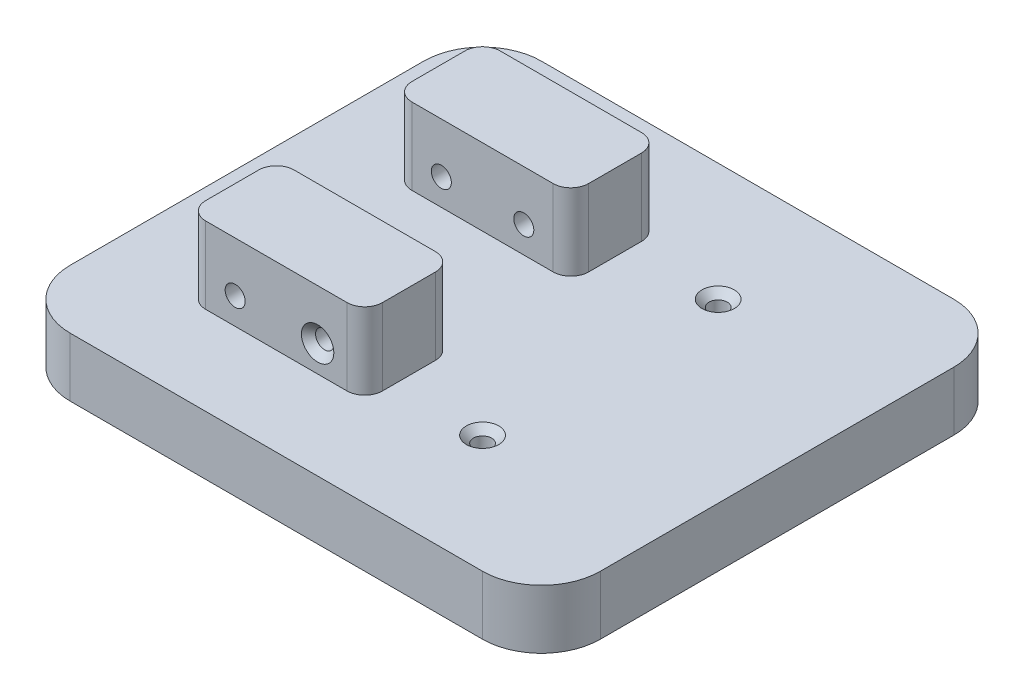
ISO-10303-21;
HEADER;
FILE_DESCRIPTION(('STEP AP214'),'2;1');
FILE_NAME('part.step','',(''),(''),'','','');
FILE_SCHEMA(('AUTOMOTIVE_DESIGN { 1 0 10303 214 1 1 1 1 }'));
ENDSEC;
DATA;
#1=APPLICATION_CONTEXT('core data for automotive mechanical design processes');
#2=APPLICATION_PROTOCOL_DEFINITION('international standard','automotive_design',2000,#1);
#3=PRODUCT_CONTEXT('',#1,'mechanical');
#4=PRODUCT('Part','Part','',(#3));
#5=PRODUCT_RELATED_PRODUCT_CATEGORY('part','',(#4));
#6=PRODUCT_DEFINITION_FORMATION('','',#4);
#7=PRODUCT_DEFINITION_CONTEXT('part definition',#1,'design');
#8=PRODUCT_DEFINITION('design','',#6,#7);
#9=PRODUCT_DEFINITION_SHAPE('','',#8);
#10=(LENGTH_UNIT() NAMED_UNIT(*) SI_UNIT(.MILLI.,.METRE.));
#11=(NAMED_UNIT(*) PLANE_ANGLE_UNIT() SI_UNIT($,.RADIAN.));
#12=(NAMED_UNIT(*) SI_UNIT($,.STERADIAN.) SOLID_ANGLE_UNIT());
#13=UNCERTAINTY_MEASURE_WITH_UNIT(LENGTH_MEASURE(1.E-05),#10,'distance_accuracy_value','');
#14=(GEOMETRIC_REPRESENTATION_CONTEXT(3) GLOBAL_UNCERTAINTY_ASSIGNED_CONTEXT((#13)) GLOBAL_UNIT_ASSIGNED_CONTEXT((#10,
#11,#12)) REPRESENTATION_CONTEXT('',''));
#15=CARTESIAN_POINT('',(0.,0.,0.));
#16=DIRECTION('',(0.,0.,1.));
#17=DIRECTION('',(1.,0.,0.));
#18=AXIS2_PLACEMENT_3D('',#15,#16,#17);
#19=CARTESIAN_POINT('',(-2.6,23.,29.4));
#20=DIRECTION('',(0.,0.,-1.));
#21=DIRECTION('',(-1.,0.,0.));
#22=AXIS2_PLACEMENT_3D('',#19,#20,#21);
#23=PLANE('',#22);
#24=CARTESIAN_POINT('',(-24.6,14.5,29.4));
#25=DIRECTION('',(0.,0.,1.));
#26=DIRECTION('',(1.,0.,0.));
#27=AXIS2_PLACEMENT_3D('',#24,#25,#26);
#28=CIRCLE('',#27,1.7);
#29=CARTESIAN_POINT('',(-22.9,14.5,29.4));
#30=VERTEX_POINT('',#29);
#31=EDGE_CURVE('E767',#30,#30,#28,.T.);
#32=ORIENTED_EDGE('',*,*,#31,.F.);
#33=EDGE_LOOP('',(#32));
#34=FACE_BOUND('',#33,.T.);
#35=DIRECTION('',(1.,0.,0.));
#36=VECTOR('',#35,1.);
#37=CARTESIAN_POINT('',(-2.6,10.,29.4));
#38=LINE('',#37,#36);
#39=CARTESIAN_POINT('',(-29.6,10.,29.4));
#40=VERTEX_POINT('',#39);
#41=CARTESIAN_POINT('',(-5.6,10.,29.4));
#42=VERTEX_POINT('',#41);
#43=EDGE_CURVE('E367',#40,#42,#38,.T.);
#44=ORIENTED_EDGE('',*,*,#43,.T.);
#45=DIRECTION('',(0.,-1.,0.));
#46=VECTOR('',#45,1.);
#47=CARTESIAN_POINT('',(-5.6,23.,29.4));
#48=LINE('',#47,#46);
#49=CARTESIAN_POINT('',(-5.6,23.,29.4));
#50=VERTEX_POINT('',#49);
#51=EDGE_CURVE('E300',#42,#50,#48,.F.);
#52=ORIENTED_EDGE('',*,*,#51,.T.);
#53=DIRECTION('',(1.,0.,0.));
#54=VECTOR('',#53,1.);
#55=CARTESIAN_POINT('',(-2.6,23.,29.4));
#56=LINE('',#55,#54);
#57=CARTESIAN_POINT('',(-29.6,23.,29.4));
#58=VERTEX_POINT('',#57);
#59=EDGE_CURVE('E355',#58,#50,#56,.T.);
#60=ORIENTED_EDGE('',*,*,#59,.F.);
#61=DIRECTION('',(0.,-1.,0.));
#62=VECTOR('',#61,1.);
#63=CARTESIAN_POINT('',(-29.6,23.,29.4));
#64=LINE('',#63,#62);
#65=EDGE_CURVE('E297',#58,#40,#64,.T.);
#66=ORIENTED_EDGE('',*,*,#65,.T.);
#67=EDGE_LOOP('',(#44,#52,#60,#66));
#68=FACE_BOUND('',#67,.T.);
#69=CARTESIAN_POINT('',(-10.6,14.5,29.4));
#70=DIRECTION('',(0.,0.,1.));
#71=DIRECTION('',(1.,0.,0.));
#72=AXIS2_PLACEMENT_3D('',#69,#70,#71);
#73=CIRCLE('',#72,2.75);
#74=CARTESIAN_POINT('',(-7.85000000000002,14.5,29.4));
#75=VERTEX_POINT('',#74);
#76=EDGE_CURVE('E775',#75,#75,#73,.T.);
#77=ORIENTED_EDGE('',*,*,#76,.F.);
#78=EDGE_LOOP('',(#77));
#79=FACE_BOUND('',#78,.T.);
#80=ADVANCED_FACE('F38',(#34,#68,#79),#23,.F.);
#81=CARTESIAN_POINT('',(0.,10.,0.));
#82=DIRECTION('',(0.,-1.,0.));
#83=DIRECTION('',(0.,0.,-1.));
#84=AXIS2_PLACEMENT_3D('',#81,#82,#83);
#85=PLANE('',#84);
#86=DIRECTION('',(-1.,0.,0.));
#87=VECTOR('',#86,1.);
#88=CARTESIAN_POINT('',(-2.6,10.,-20.6));
#89=LINE('',#88,#87);
#90=CARTESIAN_POINT('',(-5.6,10.,-20.6));
#91=VERTEX_POINT('',#90);
#92=CARTESIAN_POINT('',(-29.6,10.,-20.6));
#93=VERTEX_POINT('',#92);
#94=EDGE_CURVE('E364',#91,#93,#89,.T.);
#95=ORIENTED_EDGE('',*,*,#94,.F.);
#96=CARTESIAN_POINT('',(-5.6,10.,-17.6));
#97=DIRECTION('',(0.,-1.,0.));
#98=DIRECTION('',(0.,0.,-1.));
#99=AXIS2_PLACEMENT_3D('',#96,#97,#98);
#100=CIRCLE('',#99,3.);
#101=CARTESIAN_POINT('',(-2.6,10.,-17.6));
#102=VERTEX_POINT('',#101);
#103=EDGE_CURVE('E319',#91,#102,#100,.T.);
#104=ORIENTED_EDGE('',*,*,#103,.T.);
#105=DIRECTION('',(0.,0.,-1.));
#106=VECTOR('',#105,1.);
#107=CARTESIAN_POINT('',(-2.6,10.,-5.59999999999999));
#108=LINE('',#107,#106);
#109=CARTESIAN_POINT('',(-2.6,10.,-8.59999999999999));
#110=VERTEX_POINT('',#109);
#111=EDGE_CURVE('E376',#110,#102,#108,.T.);
#112=ORIENTED_EDGE('',*,*,#111,.F.);
#113=CARTESIAN_POINT('',(-5.6,10.,-8.59999999999999));
#114=DIRECTION('',(0.,-1.,0.));
#115=DIRECTION('',(0.,0.,-1.));
#116=AXIS2_PLACEMENT_3D('',#113,#114,#115);
#117=CIRCLE('',#116,3.);
#118=CARTESIAN_POINT('',(-5.6,10.,-5.59999999999999));
#119=VERTEX_POINT('',#118);
#120=EDGE_CURVE('E321',#110,#119,#117,.T.);
#121=ORIENTED_EDGE('',*,*,#120,.T.);
#122=DIRECTION('',(1.,0.,0.));
#123=VECTOR('',#122,1.);
#124=CARTESIAN_POINT('',(-32.6,10.,-5.59999999999999));
#125=LINE('',#124,#123);
#126=CARTESIAN_POINT('',(-29.6,10.,-5.59999999999999));
#127=VERTEX_POINT('',#126);
#128=EDGE_CURVE('E391',#127,#119,#125,.T.);
#129=ORIENTED_EDGE('',*,*,#128,.F.);
#130=CARTESIAN_POINT('',(-29.6,10.,-8.59999999999999));
#131=DIRECTION('',(0.,-1.,0.));
#132=DIRECTION('',(0.,0.,-1.));
#133=AXIS2_PLACEMENT_3D('',#130,#131,#132);
#134=CIRCLE('',#133,3.);
#135=CARTESIAN_POINT('',(-32.6,10.,-8.59999999999999));
#136=VERTEX_POINT('',#135);
#137=EDGE_CURVE('E325',#127,#136,#134,.T.);
#138=ORIENTED_EDGE('',*,*,#137,.T.);
#139=DIRECTION('',(0.,0.,1.));
#140=VECTOR('',#139,1.);
#141=CARTESIAN_POINT('',(-32.6,10.,-20.6));
#142=LINE('',#141,#140);
#143=CARTESIAN_POINT('',(-32.6,10.,-17.6));
#144=VERTEX_POINT('',#143);
#145=EDGE_CURVE('E388',#144,#136,#142,.T.);
#146=ORIENTED_EDGE('',*,*,#145,.F.);
#147=CARTESIAN_POINT('',(-29.6,10.,-17.6));
#148=DIRECTION('',(0.,-1.,0.));
#149=DIRECTION('',(0.,0.,-1.));
#150=AXIS2_PLACEMENT_3D('',#147,#148,#149);
#151=CIRCLE('',#150,3.);
#152=EDGE_CURVE('E323',#144,#93,#151,.T.);
#153=ORIENTED_EDGE('',*,*,#152,.T.);
#154=EDGE_LOOP('',(#95,#104,#112,#121,#129,#138,#146,#153));
#155=FACE_BOUND('',#154,.T.);
#156=CARTESIAN_POINT('',(12.4,10.,-15.6));
#157=DIRECTION('',(0.,1.,0.));
#158=DIRECTION('',(0.,0.,1.));
#159=AXIS2_PLACEMENT_3D('',#156,#157,#158);
#160=CIRCLE('',#159,2.75);
#161=CARTESIAN_POINT('',(12.4,10.,-12.85));
#162=VERTEX_POINT('',#161);
#163=EDGE_CURVE('E385',#162,#162,#160,.T.);
#164=ORIENTED_EDGE('',*,*,#163,.F.);
#165=EDGE_LOOP('',(#164));
#166=FACE_BOUND('',#165,.T.);
#167=CARTESIAN_POINT('',(12.4,10.,24.4));
#168=DIRECTION('',(0.,1.,0.));
#169=DIRECTION('',(0.,0.,1.));
#170=AXIS2_PLACEMENT_3D('',#167,#168,#169);
#171=CIRCLE('',#170,2.75);
#172=CARTESIAN_POINT('',(12.4,10.,27.15));
#173=VERTEX_POINT('',#172);
#174=EDGE_CURVE('E404',#173,#173,#171,.T.);
#175=ORIENTED_EDGE('',*,*,#174,.F.);
#176=EDGE_LOOP('',(#175));
#177=FACE_BOUND('',#176,.T.);
#178=DIRECTION('',(-1.,0.,0.));
#179=VECTOR('',#178,1.);
#180=CARTESIAN_POINT('',(-47.6,10.,-35.6));
#181=LINE('',#180,#179);
#182=CARTESIAN_POINT('',(32.3999999999999,10.,-35.6));
#183=VERTEX_POINT('',#182);
#184=CARTESIAN_POINT('',(-37.6,10.,-35.6));
#185=VERTEX_POINT('',#184);
#186=EDGE_CURVE('E237',#183,#185,#181,.T.);
#187=ORIENTED_EDGE('',*,*,#186,.T.);
#188=CARTESIAN_POINT('',(-37.6,10.,-25.6));
#189=DIRECTION('',(0.,-1.,0.));
#190=DIRECTION('',(0.,0.,-1.));
#191=AXIS2_PLACEMENT_3D('',#188,#189,#190);
#192=CIRCLE('',#191,10.);
#193=CARTESIAN_POINT('',(-47.6,10.,-25.6));
#194=VERTEX_POINT('',#193);
#195=EDGE_CURVE('E252',#185,#194,#192,.F.);
#196=ORIENTED_EDGE('',*,*,#195,.T.);
#197=DIRECTION('',(0.,0.,1.));
#198=VECTOR('',#197,1.);
#199=CARTESIAN_POINT('',(-47.6,10.,-35.6));
#200=LINE('',#199,#198);
#201=CARTESIAN_POINT('',(-47.6,10.,34.4));
#202=VERTEX_POINT('',#201);
#203=EDGE_CURVE('E218',#194,#202,#200,.T.);
#204=ORIENTED_EDGE('',*,*,#203,.T.);
#205=CARTESIAN_POINT('',(-37.6,10.,34.4));
#206=DIRECTION('',(0.,-1.,0.));
#207=DIRECTION('',(0.,0.,-1.));
#208=AXIS2_PLACEMENT_3D('',#205,#206,#207);
#209=CIRCLE('',#208,10.);
#210=CARTESIAN_POINT('',(-37.6,10.,44.4));
#211=VERTEX_POINT('',#210);
#212=EDGE_CURVE('E248',#202,#211,#209,.F.);
#213=ORIENTED_EDGE('',*,*,#212,.T.);
#214=DIRECTION('',(1.,0.,0.));
#215=VECTOR('',#214,1.);
#216=CARTESIAN_POINT('',(42.4,10.,44.4));
#217=LINE('',#216,#215);
#218=CARTESIAN_POINT('',(32.4,10.,44.4));
#219=VERTEX_POINT('',#218);
#220=EDGE_CURVE('E415',#211,#219,#217,.T.);
#221=ORIENTED_EDGE('',*,*,#220,.T.);
#222=CARTESIAN_POINT('',(32.4,10.,34.4));
#223=DIRECTION('',(0.,-1.,0.));
#224=DIRECTION('',(0.,0.,-1.));
#225=AXIS2_PLACEMENT_3D('',#222,#223,#224);
#226=CIRCLE('',#225,10.);
#227=CARTESIAN_POINT('',(42.4,10.,34.4));
#228=VERTEX_POINT('',#227);
#229=EDGE_CURVE('E246',#219,#228,#226,.F.);
#230=ORIENTED_EDGE('',*,*,#229,.T.);
#231=DIRECTION('',(0.,0.,-1.));
#232=VECTOR('',#231,1.);
#233=CARTESIAN_POINT('',(42.4,10.,-35.6));
#234=LINE('',#233,#232);
#235=CARTESIAN_POINT('',(42.4,10.,-25.6));
#236=VERTEX_POINT('',#235);
#237=EDGE_CURVE('E238',#228,#236,#234,.T.);
#238=ORIENTED_EDGE('',*,*,#237,.T.);
#239=CARTESIAN_POINT('',(32.4,10.,-25.6));
#240=DIRECTION('',(0.,-1.,0.));
#241=DIRECTION('',(0.,0.,-1.));
#242=AXIS2_PLACEMENT_3D('',#239,#240,#241);
#243=CIRCLE('',#242,10.);
#244=EDGE_CURVE('E250',#236,#183,#243,.F.);
#245=ORIENTED_EDGE('',*,*,#244,.T.);
#246=EDGE_LOOP('',(#187,#196,#204,#213,#221,#230,#238,#245));
#247=FACE_BOUND('',#246,.T.);
#248=DIRECTION('',(-1.,0.,0.));
#249=VECTOR('',#248,1.);
#250=CARTESIAN_POINT('',(-32.6,10.,14.4));
#251=LINE('',#250,#249);
#252=CARTESIAN_POINT('',(-5.6,10.,14.4));
#253=VERTEX_POINT('',#252);
#254=CARTESIAN_POINT('',(-29.6,10.,14.4));
#255=VERTEX_POINT('',#254);
#256=EDGE_CURVE('E333',#253,#255,#251,.T.);
#257=ORIENTED_EDGE('',*,*,#256,.F.);
#258=CARTESIAN_POINT('',(-5.6,10.,17.4));
#259=DIRECTION('',(0.,-1.,0.));
#260=DIRECTION('',(0.,0.,-1.));
#261=AXIS2_PLACEMENT_3D('',#258,#259,#260);
#262=CIRCLE('',#261,3.);
#263=CARTESIAN_POINT('',(-2.6,10.,17.4));
#264=VERTEX_POINT('',#263);
#265=EDGE_CURVE('E329',#253,#264,#262,.T.);
#266=ORIENTED_EDGE('',*,*,#265,.T.);
#267=DIRECTION('',(0.,0.,-1.));
#268=VECTOR('',#267,1.);
#269=CARTESIAN_POINT('',(-2.6,10.,14.4));
#270=LINE('',#269,#268);
#271=CARTESIAN_POINT('',(-2.6,10.,26.4));
#272=VERTEX_POINT('',#271);
#273=EDGE_CURVE('E359',#272,#264,#270,.T.);
#274=ORIENTED_EDGE('',*,*,#273,.F.);
#275=CARTESIAN_POINT('',(-5.6,10.,26.4));
#276=DIRECTION('',(0.,-1.,0.));
#277=DIRECTION('',(0.,0.,-1.));
#278=AXIS2_PLACEMENT_3D('',#275,#276,#277);
#279=CIRCLE('',#278,3.);
#280=EDGE_CURVE('E327',#272,#42,#279,.T.);
#281=ORIENTED_EDGE('',*,*,#280,.T.);
#282=ORIENTED_EDGE('',*,*,#43,.F.);
#283=CARTESIAN_POINT('',(-29.6,10.,26.4));
#284=DIRECTION('',(0.,-1.,0.));
#285=DIRECTION('',(0.,0.,-1.));
#286=AXIS2_PLACEMENT_3D('',#283,#284,#285);
#287=CIRCLE('',#286,3.);
#288=CARTESIAN_POINT('',(-32.6,10.,26.4));
#289=VERTEX_POINT('',#288);
#290=EDGE_CURVE('E11',#40,#289,#287,.T.);
#291=ORIENTED_EDGE('',*,*,#290,.T.);
#292=DIRECTION('',(0.,0.,1.));
#293=VECTOR('',#292,1.);
#294=CARTESIAN_POINT('',(-32.6,10.,29.4));
#295=LINE('',#294,#293);
#296=CARTESIAN_POINT('',(-32.6,10.,17.4));
#297=VERTEX_POINT('',#296);
#298=EDGE_CURVE('E334',#297,#289,#295,.T.);
#299=ORIENTED_EDGE('',*,*,#298,.F.);
#300=CARTESIAN_POINT('',(-29.6,10.,17.4));
#301=DIRECTION('',(0.,-1.,0.));
#302=DIRECTION('',(0.,0.,-1.));
#303=AXIS2_PLACEMENT_3D('',#300,#301,#302);
#304=CIRCLE('',#303,3.);
#305=EDGE_CURVE('E46',#297,#255,#304,.T.);
#306=ORIENTED_EDGE('',*,*,#305,.T.);
#307=EDGE_LOOP('',(#257,#266,#274,#281,#282,#291,#299,#306));
#308=FACE_BOUND('',#307,.T.);
#309=ADVANCED_FACE('F332',(#155,#166,#177,#247,#308),#85,.F.);
#310=CARTESIAN_POINT('',(-47.6,10.,-35.6));
#311=DIRECTION('',(0.,0.,1.));
#312=DIRECTION('',(1.,0.,0.));
#313=AXIS2_PLACEMENT_3D('',#310,#311,#312);
#314=PLANE('',#313);
#315=DIRECTION('',(-1.,0.,0.));
#316=VECTOR('',#315,1.);
#317=CARTESIAN_POINT('',(-47.6,0.,-35.6));
#318=LINE('',#317,#316);
#319=CARTESIAN_POINT('',(32.3999999999999,0.,-35.6));
#320=VERTEX_POINT('',#319);
#321=CARTESIAN_POINT('',(-37.6,0.,-35.6));
#322=VERTEX_POINT('',#321);
#323=EDGE_CURVE('E226',#320,#322,#318,.T.);
#324=ORIENTED_EDGE('',*,*,#323,.T.);
#325=DIRECTION('',(0.,-1.,0.));
#326=VECTOR('',#325,1.);
#327=CARTESIAN_POINT('',(-37.6,10.,-35.6));
#328=LINE('',#327,#326);
#329=EDGE_CURVE('E203',#322,#185,#328,.F.);
#330=ORIENTED_EDGE('',*,*,#329,.T.);
#331=ORIENTED_EDGE('',*,*,#186,.F.);
#332=DIRECTION('',(0.,-1.,0.));
#333=VECTOR('',#332,1.);
#334=CARTESIAN_POINT('',(32.4,10.,-35.6));
#335=LINE('',#334,#333);
#336=EDGE_CURVE('E208',#183,#320,#335,.T.);
#337=ORIENTED_EDGE('',*,*,#336,.T.);
#338=EDGE_LOOP('',(#324,#330,#331,#337));
#339=FACE_BOUND('',#338,.T.);
#340=ADVANCED_FACE('F430',(#339),#314,.F.);
#341=CARTESIAN_POINT('',(-47.6,10.,-35.6));
#342=DIRECTION('',(1.,0.,0.));
#343=DIRECTION('',(0.,0.,-1.));
#344=AXIS2_PLACEMENT_3D('',#341,#342,#343);
#345=PLANE('',#344);
#346=ORIENTED_EDGE('',*,*,#203,.F.);
#347=DIRECTION('',(0.,-1.,0.));
#348=VECTOR('',#347,1.);
#349=CARTESIAN_POINT('',(-47.6,10.,-25.6));
#350=LINE('',#349,#348);
#351=CARTESIAN_POINT('',(-47.6,0.,-25.6));
#352=VERTEX_POINT('',#351);
#353=EDGE_CURVE('E202',#194,#352,#350,.T.);
#354=ORIENTED_EDGE('',*,*,#353,.T.);
#355=DIRECTION('',(0.,0.,1.));
#356=VECTOR('',#355,1.);
#357=CARTESIAN_POINT('',(-47.6,0.,-35.6));
#358=LINE('',#357,#356);
#359=CARTESIAN_POINT('',(-47.6,0.,34.4));
#360=VERTEX_POINT('',#359);
#361=EDGE_CURVE('E215',#352,#360,#358,.T.);
#362=ORIENTED_EDGE('',*,*,#361,.T.);
#363=DIRECTION('',(0.,-1.,0.));
#364=VECTOR('',#363,1.);
#365=CARTESIAN_POINT('',(-47.6,10.,34.4));
#366=LINE('',#365,#364);
#367=EDGE_CURVE('E220',#360,#202,#366,.F.);
#368=ORIENTED_EDGE('',*,*,#367,.T.);
#369=EDGE_LOOP('',(#346,#354,#362,#368));
#370=FACE_BOUND('',#369,.T.);
#371=ADVANCED_FACE('F214',(#370),#345,.F.);
#372=CARTESIAN_POINT('',(42.4,10.,44.4));
#373=DIRECTION('',(0.,0.,-1.));
#374=DIRECTION('',(-1.,0.,0.));
#375=AXIS2_PLACEMENT_3D('',#372,#373,#374);
#376=PLANE('',#375);
#377=ORIENTED_EDGE('',*,*,#220,.F.);
#378=DIRECTION('',(0.,-1.,0.));
#379=VECTOR('',#378,1.);
#380=CARTESIAN_POINT('',(-37.6,10.,44.4));
#381=LINE('',#380,#379);
#382=CARTESIAN_POINT('',(-37.6,0.,44.4));
#383=VERTEX_POINT('',#382);
#384=EDGE_CURVE('E261',#211,#383,#381,.T.);
#385=ORIENTED_EDGE('',*,*,#384,.T.);
#386=DIRECTION('',(1.,0.,0.));
#387=VECTOR('',#386,1.);
#388=CARTESIAN_POINT('',(42.4,0.,44.4));
#389=LINE('',#388,#387);
#390=CARTESIAN_POINT('',(32.4,0.,44.4));
#391=VERTEX_POINT('',#390);
#392=EDGE_CURVE('E225',#383,#391,#389,.T.);
#393=ORIENTED_EDGE('',*,*,#392,.T.);
#394=DIRECTION('',(0.,-1.,0.));
#395=VECTOR('',#394,1.);
#396=CARTESIAN_POINT('',(32.4,10.,44.4));
#397=LINE('',#396,#395);
#398=EDGE_CURVE('E259',#391,#219,#397,.F.);
#399=ORIENTED_EDGE('',*,*,#398,.T.);
#400=EDGE_LOOP('',(#377,#385,#393,#399));
#401=FACE_BOUND('',#400,.T.);
#402=ADVANCED_FACE('F438',(#401),#376,.F.);
#403=CARTESIAN_POINT('',(42.4,10.,-35.6));
#404=DIRECTION('',(-1.,0.,0.));
#405=DIRECTION('',(0.,0.,1.));
#406=AXIS2_PLACEMENT_3D('',#403,#404,#405);
#407=PLANE('',#406);
#408=DIRECTION('',(0.,0.,-1.));
#409=VECTOR('',#408,1.);
#410=CARTESIAN_POINT('',(42.4,0.,-35.6));
#411=LINE('',#410,#409);
#412=CARTESIAN_POINT('',(42.4,0.,34.4));
#413=VERTEX_POINT('',#412);
#414=CARTESIAN_POINT('',(42.4,0.,-25.6));
#415=VERTEX_POINT('',#414);
#416=EDGE_CURVE('E229',#413,#415,#411,.T.);
#417=ORIENTED_EDGE('',*,*,#416,.T.);
#418=DIRECTION('',(0.,-1.,0.));
#419=VECTOR('',#418,1.);
#420=CARTESIAN_POINT('',(42.4,10.,-25.6));
#421=LINE('',#420,#419);
#422=EDGE_CURVE('E257',#415,#236,#421,.F.);
#423=ORIENTED_EDGE('',*,*,#422,.T.);
#424=ORIENTED_EDGE('',*,*,#237,.F.);
#425=DIRECTION('',(0.,-1.,0.));
#426=VECTOR('',#425,1.);
#427=CARTESIAN_POINT('',(42.4,10.,34.4));
#428=LINE('',#427,#426);
#429=EDGE_CURVE('E254',#228,#413,#428,.T.);
#430=ORIENTED_EDGE('',*,*,#429,.T.);
#431=EDGE_LOOP('',(#417,#423,#424,#430));
#432=FACE_BOUND('',#431,.T.);
#433=ADVANCED_FACE('F432',(#432),#407,.F.);
#434=CARTESIAN_POINT('',(0.,0.,0.));
#435=DIRECTION('',(0.,-1.,0.));
#436=DIRECTION('',(0.,0.,-1.));
#437=AXIS2_PLACEMENT_3D('',#434,#435,#436);
#438=PLANE('',#437);
#439=CARTESIAN_POINT('',(12.4,0.,-15.6));
#440=DIRECTION('',(0.,1.,0.));
#441=DIRECTION('',(0.,0.,1.));
#442=AXIS2_PLACEMENT_3D('',#439,#440,#441);
#443=CIRCLE('',#442,1.55);
#444=CARTESIAN_POINT('',(12.4,0.,-14.05));
#445=VERTEX_POINT('',#444);
#446=EDGE_CURVE('E401',#445,#445,#443,.T.);
#447=ORIENTED_EDGE('',*,*,#446,.T.);
#448=EDGE_LOOP('',(#447));
#449=FACE_BOUND('',#448,.T.);
#450=CARTESIAN_POINT('',(12.4,0.,24.4));
#451=DIRECTION('',(0.,1.,0.));
#452=DIRECTION('',(0.,0.,1.));
#453=AXIS2_PLACEMENT_3D('',#450,#451,#452);
#454=CIRCLE('',#453,1.55);
#455=CARTESIAN_POINT('',(12.4,0.,25.95));
#456=VERTEX_POINT('',#455);
#457=EDGE_CURVE('E231',#456,#456,#454,.T.);
#458=ORIENTED_EDGE('',*,*,#457,.T.);
#459=EDGE_LOOP('',(#458));
#460=FACE_BOUND('',#459,.T.);
#461=ORIENTED_EDGE('',*,*,#361,.F.);
#462=CARTESIAN_POINT('',(-37.6,0.,-25.6));
#463=DIRECTION('',(0.,-1.,0.));
#464=DIRECTION('',(0.,0.,-1.));
#465=AXIS2_PLACEMENT_3D('',#462,#463,#464);
#466=CIRCLE('',#465,10.);
#467=EDGE_CURVE('E198',#352,#322,#466,.T.);
#468=ORIENTED_EDGE('',*,*,#467,.T.);
#469=ORIENTED_EDGE('',*,*,#323,.F.);
#470=CARTESIAN_POINT('',(32.4,0.,-25.6));
#471=DIRECTION('',(0.,-1.,0.));
#472=DIRECTION('',(0.,0.,-1.));
#473=AXIS2_PLACEMENT_3D('',#470,#471,#472);
#474=CIRCLE('',#473,10.);
#475=EDGE_CURVE('E209',#320,#415,#474,.T.);
#476=ORIENTED_EDGE('',*,*,#475,.T.);
#477=ORIENTED_EDGE('',*,*,#416,.F.);
#478=CARTESIAN_POINT('',(32.4,0.,34.4));
#479=DIRECTION('',(0.,-1.,0.));
#480=DIRECTION('',(0.,0.,-1.));
#481=AXIS2_PLACEMENT_3D('',#478,#479,#480);
#482=CIRCLE('',#481,10.);
#483=EDGE_CURVE('E219',#413,#391,#482,.T.);
#484=ORIENTED_EDGE('',*,*,#483,.T.);
#485=ORIENTED_EDGE('',*,*,#392,.F.);
#486=CARTESIAN_POINT('',(-37.6,0.,34.4));
#487=DIRECTION('',(0.,-1.,0.));
#488=DIRECTION('',(0.,0.,-1.));
#489=AXIS2_PLACEMENT_3D('',#486,#487,#488);
#490=CIRCLE('',#489,10.);
#491=EDGE_CURVE('E224',#383,#360,#490,.T.);
#492=ORIENTED_EDGE('',*,*,#491,.T.);
#493=EDGE_LOOP('',(#461,#468,#469,#476,#477,#484,#485,#492));
#494=FACE_BOUND('',#493,.T.);
#495=ADVANCED_FACE('F222',(#449,#460,#494),#438,.T.);
#496=CARTESIAN_POINT('',(-37.6,10.,-25.6));
#497=DIRECTION('',(0.,-1.,0.));
#498=DIRECTION('',(0.,0.,-1.));
#499=AXIS2_PLACEMENT_3D('',#496,#497,#498);
#500=CYLINDRICAL_SURFACE('',#499,10.);
#501=ORIENTED_EDGE('',*,*,#195,.F.);
#502=ORIENTED_EDGE('',*,*,#329,.F.);
#503=ORIENTED_EDGE('',*,*,#467,.F.);
#504=ORIENTED_EDGE('',*,*,#353,.F.);
#505=EDGE_LOOP('',(#501,#502,#503,#504));
#506=FACE_BOUND('',#505,.T.);
#507=ADVANCED_FACE('F201',(#506),#500,.T.);
#508=CARTESIAN_POINT('',(32.4,10.,-25.6));
#509=DIRECTION('',(0.,-1.,0.));
#510=DIRECTION('',(0.,0.,-1.));
#511=AXIS2_PLACEMENT_3D('',#508,#509,#510);
#512=CYLINDRICAL_SURFACE('',#511,10.);
#513=ORIENTED_EDGE('',*,*,#244,.F.);
#514=ORIENTED_EDGE('',*,*,#422,.F.);
#515=ORIENTED_EDGE('',*,*,#475,.F.);
#516=ORIENTED_EDGE('',*,*,#336,.F.);
#517=EDGE_LOOP('',(#513,#514,#515,#516));
#518=FACE_BOUND('',#517,.T.);
#519=ADVANCED_FACE('F428',(#518),#512,.T.);
#520=CARTESIAN_POINT('',(-37.6,10.,34.4));
#521=DIRECTION('',(0.,-1.,0.));
#522=DIRECTION('',(0.,0.,-1.));
#523=AXIS2_PLACEMENT_3D('',#520,#521,#522);
#524=CYLINDRICAL_SURFACE('',#523,10.);
#525=ORIENTED_EDGE('',*,*,#212,.F.);
#526=ORIENTED_EDGE('',*,*,#367,.F.);
#527=ORIENTED_EDGE('',*,*,#491,.F.);
#528=ORIENTED_EDGE('',*,*,#384,.F.);
#529=EDGE_LOOP('',(#525,#526,#527,#528));
#530=FACE_BOUND('',#529,.T.);
#531=ADVANCED_FACE('F442',(#530),#524,.T.);
#532=CARTESIAN_POINT('',(32.4,10.,34.4));
#533=DIRECTION('',(0.,-1.,0.));
#534=DIRECTION('',(0.,0.,-1.));
#535=AXIS2_PLACEMENT_3D('',#532,#533,#534);
#536=CYLINDRICAL_SURFACE('',#535,10.);
#537=ORIENTED_EDGE('',*,*,#229,.F.);
#538=ORIENTED_EDGE('',*,*,#398,.F.);
#539=ORIENTED_EDGE('',*,*,#483,.F.);
#540=ORIENTED_EDGE('',*,*,#429,.F.);
#541=EDGE_LOOP('',(#537,#538,#539,#540));
#542=FACE_BOUND('',#541,.T.);
#543=ADVANCED_FACE('F434',(#542),#536,.T.);
#544=CARTESIAN_POINT('',(12.4,10.,24.4));
#545=DIRECTION('',(0.,1.,0.));
#546=DIRECTION('',(0.,0.,1.));
#547=AXIS2_PLACEMENT_3D('',#544,#545,#546);
#548=CYLINDRICAL_SURFACE('',#547,1.55);
#549=ORIENTED_EDGE('',*,*,#457,.F.);
#550=EDGE_LOOP('',(#549));
#551=FACE_BOUND('',#550,.T.);
#552=CARTESIAN_POINT('',(12.4,8.8,24.4));
#553=DIRECTION('',(0.,1.,0.));
#554=DIRECTION('',(0.,0.,1.));
#555=AXIS2_PLACEMENT_3D('',#552,#553,#554);
#556=CIRCLE('',#555,1.55);
#557=CARTESIAN_POINT('',(12.4,8.8,25.95));
#558=VERTEX_POINT('',#557);
#559=EDGE_CURVE('E407',#558,#558,#556,.T.);
#560=ORIENTED_EDGE('',*,*,#559,.T.);
#561=EDGE_LOOP('',(#560));
#562=FACE_BOUND('',#561,.T.);
#563=ADVANCED_FACE('F449',(#551,#562),#548,.F.);
#564=CARTESIAN_POINT('',(12.4,10.,24.4));
#565=DIRECTION('',(0.,1.,0.));
#566=DIRECTION('',(0.,0.,1.));
#567=AXIS2_PLACEMENT_3D('',#564,#565,#566);
#568=CONICAL_SURFACE('',#567,2.75,0.785398163397448);
#569=ORIENTED_EDGE('',*,*,#559,.F.);
#570=EDGE_LOOP('',(#569));
#571=FACE_BOUND('',#570,.T.);
#572=ORIENTED_EDGE('',*,*,#174,.T.);
#573=EDGE_LOOP('',(#572));
#574=FACE_BOUND('',#573,.T.);
#575=ADVANCED_FACE('F498',(#571,#574),#568,.F.);
#576=CARTESIAN_POINT('',(12.4,10.,-15.6));
#577=DIRECTION('',(0.,1.,0.));
#578=DIRECTION('',(0.,0.,1.));
#579=AXIS2_PLACEMENT_3D('',#576,#577,#578);
#580=CYLINDRICAL_SURFACE('',#579,1.55);
#581=ORIENTED_EDGE('',*,*,#446,.F.);
#582=EDGE_LOOP('',(#581));
#583=FACE_BOUND('',#582,.T.);
#584=CARTESIAN_POINT('',(12.4,8.8,-15.6));
#585=DIRECTION('',(0.,1.,0.));
#586=DIRECTION('',(0.,0.,1.));
#587=AXIS2_PLACEMENT_3D('',#584,#585,#586);
#588=CIRCLE('',#587,1.55);
#589=CARTESIAN_POINT('',(12.4,8.8,-14.05));
#590=VERTEX_POINT('',#589);
#591=EDGE_CURVE('E398',#590,#590,#588,.T.);
#592=ORIENTED_EDGE('',*,*,#591,.T.);
#593=EDGE_LOOP('',(#592));
#594=FACE_BOUND('',#593,.T.);
#595=ADVANCED_FACE('F494',(#583,#594),#580,.F.);
#596=CARTESIAN_POINT('',(12.4,10.,-15.6));
#597=DIRECTION('',(0.,1.,0.));
#598=DIRECTION('',(0.,0.,1.));
#599=AXIS2_PLACEMENT_3D('',#596,#597,#598);
#600=CONICAL_SURFACE('',#599,2.75,0.785398163397448);
#601=ORIENTED_EDGE('',*,*,#591,.F.);
#602=EDGE_LOOP('',(#601));
#603=FACE_BOUND('',#602,.T.);
#604=ORIENTED_EDGE('',*,*,#163,.T.);
#605=EDGE_LOOP('',(#604));
#606=FACE_BOUND('',#605,.T.);
#607=ADVANCED_FACE('F490',(#603,#606),#600,.F.);
#608=CARTESIAN_POINT('',(-2.6,23.,-20.6));
#609=DIRECTION('',(0.,0.,1.));
#610=DIRECTION('',(1.,0.,0.));
#611=AXIS2_PLACEMENT_3D('',#608,#609,#610);
#612=PLANE('',#611);
#613=CARTESIAN_POINT('',(-10.6,14.5,-20.6));
#614=DIRECTION('',(0.,0.,-1.));
#615=DIRECTION('',(-1.,0.,0.));
#616=AXIS2_PLACEMENT_3D('',#613,#614,#615);
#617=CIRCLE('',#616,1.7);
#618=CARTESIAN_POINT('',(-12.3,14.5,-20.6));
#619=VERTEX_POINT('',#618);
#620=EDGE_CURVE('E776',#619,#619,#617,.T.);
#621=ORIENTED_EDGE('',*,*,#620,.F.);
#622=EDGE_LOOP('',(#621));
#623=FACE_BOUND('',#622,.T.);
#624=CARTESIAN_POINT('',(-24.6,14.5,-20.6));
#625=DIRECTION('',(0.,0.,-1.));
#626=DIRECTION('',(-1.,0.,0.));
#627=AXIS2_PLACEMENT_3D('',#624,#625,#626);
#628=CIRCLE('',#627,1.7);
#629=CARTESIAN_POINT('',(-26.3,14.5,-20.6));
#630=VERTEX_POINT('',#629);
#631=EDGE_CURVE('E769',#630,#630,#628,.T.);
#632=ORIENTED_EDGE('',*,*,#631,.F.);
#633=EDGE_LOOP('',(#632));
#634=FACE_BOUND('',#633,.T.);
#635=DIRECTION('',(-1.,0.,0.));
#636=VECTOR('',#635,1.);
#637=CARTESIAN_POINT('',(-2.6,23.,-20.6));
#638=LINE('',#637,#636);
#639=CARTESIAN_POINT('',(-5.6,23.,-20.6));
#640=VERTEX_POINT('',#639);
#641=CARTESIAN_POINT('',(-29.6,23.,-20.6));
#642=VERTEX_POINT('',#641);
#643=EDGE_CURVE('E372',#640,#642,#638,.T.);
#644=ORIENTED_EDGE('',*,*,#643,.F.);
#645=DIRECTION('',(0.,-1.,0.));
#646=VECTOR('',#645,1.);
#647=CARTESIAN_POINT('',(-5.6,23.,-20.6));
#648=LINE('',#647,#646);
#649=EDGE_CURVE('E266',#640,#91,#648,.T.);
#650=ORIENTED_EDGE('',*,*,#649,.T.);
#651=ORIENTED_EDGE('',*,*,#94,.T.);
#652=DIRECTION('',(0.,-1.,0.));
#653=VECTOR('',#652,1.);
#654=CARTESIAN_POINT('',(-29.6,23.,-20.6));
#655=LINE('',#654,#653);
#656=EDGE_CURVE('E264',#93,#642,#655,.F.);
#657=ORIENTED_EDGE('',*,*,#656,.T.);
#658=EDGE_LOOP('',(#644,#650,#651,#657));
#659=FACE_BOUND('',#658,.T.);
#660=ADVANCED_FACE('F486',(#623,#634,#659),#612,.F.);
#661=CARTESIAN_POINT('',(-32.6,23.,-20.6));
#662=DIRECTION('',(1.,0.,0.));
#663=DIRECTION('',(0.,0.,-1.));
#664=AXIS2_PLACEMENT_3D('',#661,#662,#663);
#665=PLANE('',#664);
#666=DIRECTION('',(0.,0.,1.));
#667=VECTOR('',#666,1.);
#668=CARTESIAN_POINT('',(-32.6,23.,-20.6));
#669=LINE('',#668,#667);
#670=CARTESIAN_POINT('',(-32.6,23.,-17.6));
#671=VERTEX_POINT('',#670);
#672=CARTESIAN_POINT('',(-32.6,23.,-8.59999999999999));
#673=VERTEX_POINT('',#672);
#674=EDGE_CURVE('E375',#671,#673,#669,.T.);
#675=ORIENTED_EDGE('',*,*,#674,.F.);
#676=DIRECTION('',(0.,-1.,0.));
#677=VECTOR('',#676,1.);
#678=CARTESIAN_POINT('',(-32.6,23.,-17.6));
#679=LINE('',#678,#677);
#680=EDGE_CURVE('E289',#671,#144,#679,.T.);
#681=ORIENTED_EDGE('',*,*,#680,.T.);
#682=ORIENTED_EDGE('',*,*,#145,.T.);
#683=DIRECTION('',(0.,-1.,0.));
#684=VECTOR('',#683,1.);
#685=CARTESIAN_POINT('',(-32.6,23.,-8.59999999999999));
#686=LINE('',#685,#684);
#687=EDGE_CURVE('E287',#136,#673,#686,.F.);
#688=ORIENTED_EDGE('',*,*,#687,.T.);
#689=EDGE_LOOP('',(#675,#681,#682,#688));
#690=FACE_BOUND('',#689,.T.);
#691=ADVANCED_FACE('F482',(#690),#665,.F.);
#692=CARTESIAN_POINT('',(-32.6,23.,-5.59999999999999));
#693=DIRECTION('',(0.,0.,-1.));
#694=DIRECTION('',(-1.,0.,0.));
#695=AXIS2_PLACEMENT_3D('',#692,#693,#694);
#696=PLANE('',#695);
#697=CARTESIAN_POINT('',(-10.6,14.5,-5.59999999999999));
#698=DIRECTION('',(0.,0.,-1.));
#699=DIRECTION('',(-1.,0.,0.));
#700=AXIS2_PLACEMENT_3D('',#697,#698,#699);
#701=CIRCLE('',#700,1.7);
#702=CARTESIAN_POINT('',(-12.3,14.5,-5.59999999999999));
#703=VERTEX_POINT('',#702);
#704=EDGE_CURVE('E772',#703,#703,#701,.T.);
#705=ORIENTED_EDGE('',*,*,#704,.T.);
#706=EDGE_LOOP('',(#705));
#707=FACE_BOUND('',#706,.T.);
#708=CARTESIAN_POINT('',(-24.6,14.5,-5.59999999999999));
#709=DIRECTION('',(0.,0.,-1.));
#710=DIRECTION('',(-1.,0.,0.));
#711=AXIS2_PLACEMENT_3D('',#708,#709,#710);
#712=CIRCLE('',#711,1.7);
#713=CARTESIAN_POINT('',(-26.3,14.5,-5.59999999999999));
#714=VERTEX_POINT('',#713);
#715=EDGE_CURVE('E779',#714,#714,#712,.T.);
#716=ORIENTED_EDGE('',*,*,#715,.T.);
#717=EDGE_LOOP('',(#716));
#718=FACE_BOUND('',#717,.T.);
#719=ORIENTED_EDGE('',*,*,#128,.T.);
#720=DIRECTION('',(0.,-1.,0.));
#721=VECTOR('',#720,1.);
#722=CARTESIAN_POINT('',(-5.6,23.,-5.59999999999999));
#723=LINE('',#722,#721);
#724=CARTESIAN_POINT('',(-5.6,23.,-5.59999999999999));
#725=VERTEX_POINT('',#724);
#726=EDGE_CURVE('E285',#119,#725,#723,.F.);
#727=ORIENTED_EDGE('',*,*,#726,.T.);
#728=DIRECTION('',(1.,0.,0.));
#729=VECTOR('',#728,1.);
#730=CARTESIAN_POINT('',(-32.6,23.,-5.59999999999999));
#731=LINE('',#730,#729);
#732=CARTESIAN_POINT('',(-29.6,23.,-5.59999999999999));
#733=VERTEX_POINT('',#732);
#734=EDGE_CURVE('E379',#733,#725,#731,.T.);
#735=ORIENTED_EDGE('',*,*,#734,.F.);
#736=DIRECTION('',(0.,-1.,0.));
#737=VECTOR('',#736,1.);
#738=CARTESIAN_POINT('',(-29.6,23.,-5.59999999999999));
#739=LINE('',#738,#737);
#740=EDGE_CURVE('E282',#733,#127,#739,.T.);
#741=ORIENTED_EDGE('',*,*,#740,.T.);
#742=EDGE_LOOP('',(#719,#727,#735,#741));
#743=FACE_BOUND('',#742,.T.);
#744=ADVANCED_FACE('F478',(#707,#718,#743),#696,.F.);
#745=CARTESIAN_POINT('',(-2.6,23.,-5.59999999999999));
#746=DIRECTION('',(-1.,0.,0.));
#747=DIRECTION('',(0.,0.,1.));
#748=AXIS2_PLACEMENT_3D('',#745,#746,#747);
#749=PLANE('',#748);
#750=ORIENTED_EDGE('',*,*,#111,.T.);
#751=DIRECTION('',(0.,-1.,0.));
#752=VECTOR('',#751,1.);
#753=CARTESIAN_POINT('',(-2.6,23.,-17.6));
#754=LINE('',#753,#752);
#755=CARTESIAN_POINT('',(-2.6,23.,-17.6));
#756=VERTEX_POINT('',#755);
#757=EDGE_CURVE('E272',#102,#756,#754,.F.);
#758=ORIENTED_EDGE('',*,*,#757,.T.);
#759=DIRECTION('',(0.,0.,-1.));
#760=VECTOR('',#759,1.);
#761=CARTESIAN_POINT('',(-2.6,23.,-5.59999999999999));
#762=LINE('',#761,#760);
#763=CARTESIAN_POINT('',(-2.6,23.,-8.59999999999999));
#764=VERTEX_POINT('',#763);
#765=EDGE_CURVE('E382',#764,#756,#762,.T.);
#766=ORIENTED_EDGE('',*,*,#765,.F.);
#767=DIRECTION('',(0.,-1.,0.));
#768=VECTOR('',#767,1.);
#769=CARTESIAN_POINT('',(-2.6,23.,-8.59999999999999));
#770=LINE('',#769,#768);
#771=EDGE_CURVE('E269',#764,#110,#770,.T.);
#772=ORIENTED_EDGE('',*,*,#771,.T.);
#773=EDGE_LOOP('',(#750,#758,#766,#772));
#774=FACE_BOUND('',#773,.T.);
#775=ADVANCED_FACE('F474',(#774),#749,.F.);
#776=CARTESIAN_POINT('',(0.,23.,0.));
#777=DIRECTION('',(0.,1.,0.));
#778=DIRECTION('',(0.,0.,1.));
#779=AXIS2_PLACEMENT_3D('',#776,#777,#778);
#780=PLANE('',#779);
#781=ORIENTED_EDGE('',*,*,#765,.T.);
#782=CARTESIAN_POINT('',(-5.6,23.,-17.6));
#783=DIRECTION('',(0.,1.,0.));
#784=DIRECTION('',(0.,0.,1.));
#785=AXIS2_PLACEMENT_3D('',#782,#783,#784);
#786=CIRCLE('',#785,3.);
#787=EDGE_CURVE('E280',#756,#640,#786,.T.);
#788=ORIENTED_EDGE('',*,*,#787,.T.);
#789=ORIENTED_EDGE('',*,*,#643,.T.);
#790=CARTESIAN_POINT('',(-29.6,23.,-17.6));
#791=DIRECTION('',(0.,1.,0.));
#792=DIRECTION('',(0.,0.,1.));
#793=AXIS2_PLACEMENT_3D('',#790,#791,#792);
#794=CIRCLE('',#793,3.);
#795=EDGE_CURVE('E276',#642,#671,#794,.T.);
#796=ORIENTED_EDGE('',*,*,#795,.T.);
#797=ORIENTED_EDGE('',*,*,#674,.T.);
#798=CARTESIAN_POINT('',(-29.6,23.,-8.59999999999999));
#799=DIRECTION('',(0.,1.,0.));
#800=DIRECTION('',(0.,0.,1.));
#801=AXIS2_PLACEMENT_3D('',#798,#799,#800);
#802=CIRCLE('',#801,3.);
#803=EDGE_CURVE('E274',#673,#733,#802,.T.);
#804=ORIENTED_EDGE('',*,*,#803,.T.);
#805=ORIENTED_EDGE('',*,*,#734,.T.);
#806=CARTESIAN_POINT('',(-5.6,23.,-8.59999999999999));
#807=DIRECTION('',(0.,1.,0.));
#808=DIRECTION('',(0.,0.,1.));
#809=AXIS2_PLACEMENT_3D('',#806,#807,#808);
#810=CIRCLE('',#809,3.);
#811=EDGE_CURVE('E278',#725,#764,#810,.T.);
#812=ORIENTED_EDGE('',*,*,#811,.T.);
#813=EDGE_LOOP('',(#781,#788,#789,#796,#797,#804,#805,#812));
#814=FACE_BOUND('',#813,.T.);
#815=ADVANCED_FACE('F470',(#814),#780,.T.);
#816=CARTESIAN_POINT('',(-32.6,23.,14.4));
#817=DIRECTION('',(0.,0.,1.));
#818=DIRECTION('',(1.,0.,0.));
#819=AXIS2_PLACEMENT_3D('',#816,#817,#818);
#820=PLANE('',#819);
#821=CARTESIAN_POINT('',(-24.6,14.5,14.4));
#822=DIRECTION('',(0.,0.,1.));
#823=DIRECTION('',(1.,0.,0.));
#824=AXIS2_PLACEMENT_3D('',#821,#822,#823);
#825=CIRCLE('',#824,1.7);
#826=CARTESIAN_POINT('',(-22.9,14.5,14.4));
#827=VERTEX_POINT('',#826);
#828=EDGE_CURVE('E765',#827,#827,#825,.T.);
#829=ORIENTED_EDGE('',*,*,#828,.T.);
#830=EDGE_LOOP('',(#829));
#831=FACE_BOUND('',#830,.T.);
#832=CARTESIAN_POINT('',(-10.6,14.5,14.4));
#833=DIRECTION('',(0.,0.,1.));
#834=DIRECTION('',(1.,0.,0.));
#835=AXIS2_PLACEMENT_3D('',#832,#833,#834);
#836=CIRCLE('',#835,1.55);
#837=CARTESIAN_POINT('',(-9.05000000000002,14.5,14.4));
#838=VERTEX_POINT('',#837);
#839=EDGE_CURVE('E340',#838,#838,#836,.T.);
#840=ORIENTED_EDGE('',*,*,#839,.T.);
#841=EDGE_LOOP('',(#840));
#842=FACE_BOUND('',#841,.T.);
#843=DIRECTION('',(-1.,0.,0.));
#844=VECTOR('',#843,1.);
#845=CARTESIAN_POINT('',(-32.6,23.,14.4));
#846=LINE('',#845,#844);
#847=CARTESIAN_POINT('',(-5.6,23.,14.4));
#848=VERTEX_POINT('',#847);
#849=CARTESIAN_POINT('',(-29.6,23.,14.4));
#850=VERTEX_POINT('',#849);
#851=EDGE_CURVE('E351',#848,#850,#846,.T.);
#852=ORIENTED_EDGE('',*,*,#851,.F.);
#853=DIRECTION('',(0.,-1.,0.));
#854=VECTOR('',#853,1.);
#855=CARTESIAN_POINT('',(-5.6,23.,14.4));
#856=LINE('',#855,#854);
#857=EDGE_CURVE('E312',#848,#253,#856,.T.);
#858=ORIENTED_EDGE('',*,*,#857,.T.);
#859=ORIENTED_EDGE('',*,*,#256,.T.);
#860=DIRECTION('',(0.,-1.,0.));
#861=VECTOR('',#860,1.);
#862=CARTESIAN_POINT('',(-29.6,23.,14.4));
#863=LINE('',#862,#861);
#864=EDGE_CURVE('E310',#255,#850,#863,.F.);
#865=ORIENTED_EDGE('',*,*,#864,.T.);
#866=EDGE_LOOP('',(#852,#858,#859,#865));
#867=FACE_BOUND('',#866,.T.);
#868=ADVANCED_FACE('F337',(#831,#842,#867),#820,.F.);
#869=CARTESIAN_POINT('',(-32.6,23.,29.4));
#870=DIRECTION('',(1.,0.,0.));
#871=DIRECTION('',(0.,0.,-1.));
#872=AXIS2_PLACEMENT_3D('',#869,#870,#871);
#873=PLANE('',#872);
#874=DIRECTION('',(0.,0.,1.));
#875=VECTOR('',#874,1.);
#876=CARTESIAN_POINT('',(-32.6,23.,29.4));
#877=LINE('',#876,#875);
#878=CARTESIAN_POINT('',(-32.6,23.,17.4));
#879=VERTEX_POINT('',#878);
#880=CARTESIAN_POINT('',(-32.6,23.,26.4));
#881=VERTEX_POINT('',#880);
#882=EDGE_CURVE('E349',#879,#881,#877,.T.);
#883=ORIENTED_EDGE('',*,*,#882,.F.);
#884=DIRECTION('',(0.,-1.,0.));
#885=VECTOR('',#884,1.);
#886=CARTESIAN_POINT('',(-32.6,23.,17.4));
#887=LINE('',#886,#885);
#888=EDGE_CURVE('E317',#879,#297,#887,.T.);
#889=ORIENTED_EDGE('',*,*,#888,.T.);
#890=ORIENTED_EDGE('',*,*,#298,.T.);
#891=DIRECTION('',(0.,-1.,0.));
#892=VECTOR('',#891,1.);
#893=CARTESIAN_POINT('',(-32.6,23.,26.4));
#894=LINE('',#893,#892);
#895=EDGE_CURVE('E315',#289,#881,#894,.F.);
#896=ORIENTED_EDGE('',*,*,#895,.T.);
#897=EDGE_LOOP('',(#883,#889,#890,#896));
#898=FACE_BOUND('',#897,.T.);
#899=ADVANCED_FACE('F353',(#898),#873,.F.);
#900=CARTESIAN_POINT('',(-2.6,23.,14.4));
#901=DIRECTION('',(-1.,0.,0.));
#902=DIRECTION('',(0.,0.,1.));
#903=AXIS2_PLACEMENT_3D('',#900,#901,#902);
#904=PLANE('',#903);
#905=DIRECTION('',(0.,0.,-1.));
#906=VECTOR('',#905,1.);
#907=CARTESIAN_POINT('',(-2.6,23.,14.4));
#908=LINE('',#907,#906);
#909=CARTESIAN_POINT('',(-2.6,23.,26.4));
#910=VERTEX_POINT('',#909);
#911=CARTESIAN_POINT('',(-2.6,23.,17.4));
#912=VERTEX_POINT('',#911);
#913=EDGE_CURVE('E357',#910,#912,#908,.T.);
#914=ORIENTED_EDGE('',*,*,#913,.F.);
#915=DIRECTION('',(0.,-1.,0.));
#916=VECTOR('',#915,1.);
#917=CARTESIAN_POINT('',(-2.6,23.,26.4));
#918=LINE('',#917,#916);
#919=EDGE_CURVE('E294',#910,#272,#918,.T.);
#920=ORIENTED_EDGE('',*,*,#919,.T.);
#921=ORIENTED_EDGE('',*,*,#273,.T.);
#922=DIRECTION('',(0.,-1.,0.));
#923=VECTOR('',#922,1.);
#924=CARTESIAN_POINT('',(-2.6,23.,17.4));
#925=LINE('',#924,#923);
#926=EDGE_CURVE('E292',#264,#912,#925,.F.);
#927=ORIENTED_EDGE('',*,*,#926,.T.);
#928=EDGE_LOOP('',(#914,#920,#921,#927));
#929=FACE_BOUND('',#928,.T.);
#930=ADVANCED_FACE('F464',(#929),#904,.F.);
#931=CARTESIAN_POINT('',(0.,23.,0.));
#932=DIRECTION('',(0.,-1.,0.));
#933=DIRECTION('',(0.,0.,-1.));
#934=AXIS2_PLACEMENT_3D('',#931,#932,#933);
#935=PLANE('',#934);
#936=ORIENTED_EDGE('',*,*,#59,.T.);
#937=CARTESIAN_POINT('',(-5.6,23.,26.4));
#938=DIRECTION('',(0.,-1.,0.));
#939=DIRECTION('',(0.,0.,-1.));
#940=AXIS2_PLACEMENT_3D('',#937,#938,#939);
#941=CIRCLE('',#940,3.);
#942=EDGE_CURVE('E308',#50,#910,#941,.F.);
#943=ORIENTED_EDGE('',*,*,#942,.T.);
#944=ORIENTED_EDGE('',*,*,#913,.T.);
#945=CARTESIAN_POINT('',(-5.6,23.,17.4));
#946=DIRECTION('',(0.,-1.,0.));
#947=DIRECTION('',(0.,0.,-1.));
#948=AXIS2_PLACEMENT_3D('',#945,#946,#947);
#949=CIRCLE('',#948,3.);
#950=EDGE_CURVE('E306',#912,#848,#949,.F.);
#951=ORIENTED_EDGE('',*,*,#950,.T.);
#952=ORIENTED_EDGE('',*,*,#851,.T.);
#953=CARTESIAN_POINT('',(-29.6,23.,17.4));
#954=DIRECTION('',(0.,-1.,0.));
#955=DIRECTION('',(0.,0.,-1.));
#956=AXIS2_PLACEMENT_3D('',#953,#954,#955);
#957=CIRCLE('',#956,3.);
#958=EDGE_CURVE('E304',#850,#879,#957,.F.);
#959=ORIENTED_EDGE('',*,*,#958,.T.);
#960=ORIENTED_EDGE('',*,*,#882,.T.);
#961=CARTESIAN_POINT('',(-29.6,23.,26.4));
#962=DIRECTION('',(0.,-1.,0.));
#963=DIRECTION('',(0.,0.,-1.));
#964=AXIS2_PLACEMENT_3D('',#961,#962,#963);
#965=CIRCLE('',#964,3.);
#966=EDGE_CURVE('E302',#881,#58,#965,.F.);
#967=ORIENTED_EDGE('',*,*,#966,.T.);
#968=EDGE_LOOP('',(#936,#943,#944,#951,#952,#959,#960,#967));
#969=FACE_BOUND('',#968,.T.);
#970=ADVANCED_FACE('F348',(#969),#935,.F.);
#971=CARTESIAN_POINT('',(-10.6,14.5,29.4));
#972=DIRECTION('',(0.,0.,1.));
#973=DIRECTION('',(1.,0.,0.));
#974=AXIS2_PLACEMENT_3D('',#971,#972,#973);
#975=CYLINDRICAL_SURFACE('',#974,1.55);
#976=ORIENTED_EDGE('',*,*,#839,.F.);
#977=EDGE_LOOP('',(#976));
#978=FACE_BOUND('',#977,.T.);
#979=CARTESIAN_POINT('',(-10.6,14.5,28.2));
#980=DIRECTION('',(0.,0.,1.));
#981=DIRECTION('',(1.,0.,0.));
#982=AXIS2_PLACEMENT_3D('',#979,#980,#981);
#983=CIRCLE('',#982,1.55);
#984=CARTESIAN_POINT('',(-9.05000000000002,14.5,28.2));
#985=VERTEX_POINT('',#984);
#986=EDGE_CURVE('E786',#985,#985,#983,.T.);
#987=ORIENTED_EDGE('',*,*,#986,.T.);
#988=EDGE_LOOP('',(#987));
#989=FACE_BOUND('',#988,.T.);
#990=ADVANCED_FACE('F572',(#978,#989),#975,.F.);
#991=CARTESIAN_POINT('',(-10.6,14.5,29.4));
#992=DIRECTION('',(0.,0.,1.));
#993=DIRECTION('',(1.,0.,0.));
#994=AXIS2_PLACEMENT_3D('',#991,#992,#993);
#995=CONICAL_SURFACE('',#994,2.75,0.785398163397448);
#996=ORIENTED_EDGE('',*,*,#986,.F.);
#997=EDGE_LOOP('',(#996));
#998=FACE_BOUND('',#997,.T.);
#999=ORIENTED_EDGE('',*,*,#76,.T.);
#1000=EDGE_LOOP('',(#999));
#1001=FACE_BOUND('',#1000,.T.);
#1002=ADVANCED_FACE('F577',(#998,#1001),#995,.F.);
#1003=CARTESIAN_POINT('',(-5.6,23.,-17.6));
#1004=DIRECTION('',(0.,-1.,0.));
#1005=DIRECTION('',(0.,0.,-1.));
#1006=AXIS2_PLACEMENT_3D('',#1003,#1004,#1005);
#1007=CYLINDRICAL_SURFACE('',#1006,3.);
#1008=ORIENTED_EDGE('',*,*,#787,.F.);
#1009=ORIENTED_EDGE('',*,*,#757,.F.);
#1010=ORIENTED_EDGE('',*,*,#103,.F.);
#1011=ORIENTED_EDGE('',*,*,#649,.F.);
#1012=EDGE_LOOP('',(#1008,#1009,#1010,#1011));
#1013=FACE_BOUND('',#1012,.T.);
#1014=ADVANCED_FACE('F589',(#1013),#1007,.T.);
#1015=CARTESIAN_POINT('',(-5.6,23.,-8.59999999999999));
#1016=DIRECTION('',(0.,-1.,0.));
#1017=DIRECTION('',(0.,0.,-1.));
#1018=AXIS2_PLACEMENT_3D('',#1015,#1016,#1017);
#1019=CYLINDRICAL_SURFACE('',#1018,3.);
#1020=ORIENTED_EDGE('',*,*,#811,.F.);
#1021=ORIENTED_EDGE('',*,*,#726,.F.);
#1022=ORIENTED_EDGE('',*,*,#120,.F.);
#1023=ORIENTED_EDGE('',*,*,#771,.F.);
#1024=EDGE_LOOP('',(#1020,#1021,#1022,#1023));
#1025=FACE_BOUND('',#1024,.T.);
#1026=ADVANCED_FACE('F645',(#1025),#1019,.T.);
#1027=CARTESIAN_POINT('',(-29.6,23.,-17.6));
#1028=DIRECTION('',(0.,-1.,0.));
#1029=DIRECTION('',(0.,0.,-1.));
#1030=AXIS2_PLACEMENT_3D('',#1027,#1028,#1029);
#1031=CYLINDRICAL_SURFACE('',#1030,3.);
#1032=ORIENTED_EDGE('',*,*,#795,.F.);
#1033=ORIENTED_EDGE('',*,*,#656,.F.);
#1034=ORIENTED_EDGE('',*,*,#152,.F.);
#1035=ORIENTED_EDGE('',*,*,#680,.F.);
#1036=EDGE_LOOP('',(#1032,#1033,#1034,#1035));
#1037=FACE_BOUND('',#1036,.T.);
#1038=ADVANCED_FACE('F655',(#1037),#1031,.T.);
#1039=CARTESIAN_POINT('',(-29.6,23.,-8.59999999999999));
#1040=DIRECTION('',(0.,-1.,0.));
#1041=DIRECTION('',(0.,0.,-1.));
#1042=AXIS2_PLACEMENT_3D('',#1039,#1040,#1041);
#1043=CYLINDRICAL_SURFACE('',#1042,3.);
#1044=ORIENTED_EDGE('',*,*,#803,.F.);
#1045=ORIENTED_EDGE('',*,*,#687,.F.);
#1046=ORIENTED_EDGE('',*,*,#137,.F.);
#1047=ORIENTED_EDGE('',*,*,#740,.F.);
#1048=EDGE_LOOP('',(#1044,#1045,#1046,#1047));
#1049=FACE_BOUND('',#1048,.T.);
#1050=ADVANCED_FACE('F665',(#1049),#1043,.T.);
#1051=CARTESIAN_POINT('',(-5.6,23.,26.4));
#1052=DIRECTION('',(0.,-1.,0.));
#1053=DIRECTION('',(0.,0.,-1.));
#1054=AXIS2_PLACEMENT_3D('',#1051,#1052,#1053);
#1055=CYLINDRICAL_SURFACE('',#1054,3.);
#1056=ORIENTED_EDGE('',*,*,#942,.F.);
#1057=ORIENTED_EDGE('',*,*,#51,.F.);
#1058=ORIENTED_EDGE('',*,*,#280,.F.);
#1059=ORIENTED_EDGE('',*,*,#919,.F.);
#1060=EDGE_LOOP('',(#1056,#1057,#1058,#1059));
#1061=FACE_BOUND('',#1060,.T.);
#1062=ADVANCED_FACE('F675',(#1061),#1055,.T.);
#1063=CARTESIAN_POINT('',(-5.6,23.,17.4));
#1064=DIRECTION('',(0.,-1.,0.));
#1065=DIRECTION('',(0.,0.,-1.));
#1066=AXIS2_PLACEMENT_3D('',#1063,#1064,#1065);
#1067=CYLINDRICAL_SURFACE('',#1066,3.);
#1068=ORIENTED_EDGE('',*,*,#950,.F.);
#1069=ORIENTED_EDGE('',*,*,#926,.F.);
#1070=ORIENTED_EDGE('',*,*,#265,.F.);
#1071=ORIENTED_EDGE('',*,*,#857,.F.);
#1072=EDGE_LOOP('',(#1068,#1069,#1070,#1071));
#1073=FACE_BOUND('',#1072,.T.);
#1074=ADVANCED_FACE('F685',(#1073),#1067,.T.);
#1075=CARTESIAN_POINT('',(-29.6,23.,17.4));
#1076=DIRECTION('',(0.,-1.,0.));
#1077=DIRECTION('',(0.,0.,-1.));
#1078=AXIS2_PLACEMENT_3D('',#1075,#1076,#1077);
#1079=CYLINDRICAL_SURFACE('',#1078,3.);
#1080=ORIENTED_EDGE('',*,*,#958,.F.);
#1081=ORIENTED_EDGE('',*,*,#864,.F.);
#1082=ORIENTED_EDGE('',*,*,#305,.F.);
#1083=ORIENTED_EDGE('',*,*,#888,.F.);
#1084=EDGE_LOOP('',(#1080,#1081,#1082,#1083));
#1085=FACE_BOUND('',#1084,.T.);
#1086=ADVANCED_FACE('F343',(#1085),#1079,.T.);
#1087=CARTESIAN_POINT('',(-29.6,23.,26.4));
#1088=DIRECTION('',(0.,-1.,0.));
#1089=DIRECTION('',(0.,0.,-1.));
#1090=AXIS2_PLACEMENT_3D('',#1087,#1088,#1089);
#1091=CYLINDRICAL_SURFACE('',#1090,3.);
#1092=ORIENTED_EDGE('',*,*,#966,.F.);
#1093=ORIENTED_EDGE('',*,*,#895,.F.);
#1094=ORIENTED_EDGE('',*,*,#290,.F.);
#1095=ORIENTED_EDGE('',*,*,#65,.F.);
#1096=EDGE_LOOP('',(#1092,#1093,#1094,#1095));
#1097=FACE_BOUND('',#1096,.T.);
#1098=ADVANCED_FACE('F40',(#1097),#1091,.T.);
#1099=CARTESIAN_POINT('',(-24.6,14.5,-5.59999999999999));
#1100=DIRECTION('',(0.,0.,-1.));
#1101=DIRECTION('',(-1.,0.,0.));
#1102=AXIS2_PLACEMENT_3D('',#1099,#1100,#1101);
#1103=CYLINDRICAL_SURFACE('',#1102,1.7);
#1104=ORIENTED_EDGE('',*,*,#715,.F.);
#1105=EDGE_LOOP('',(#1104));
#1106=FACE_BOUND('',#1105,.T.);
#1107=ORIENTED_EDGE('',*,*,#631,.T.);
#1108=EDGE_LOOP('',(#1107));
#1109=FACE_BOUND('',#1108,.T.);
#1110=ADVANCED_FACE('F711',(#1106,#1109),#1103,.F.);
#1111=CARTESIAN_POINT('',(-10.6,14.5,-5.59999999999999));
#1112=DIRECTION('',(0.,0.,-1.));
#1113=DIRECTION('',(-1.,0.,0.));
#1114=AXIS2_PLACEMENT_3D('',#1111,#1112,#1113);
#1115=CYLINDRICAL_SURFACE('',#1114,1.7);
#1116=ORIENTED_EDGE('',*,*,#704,.F.);
#1117=EDGE_LOOP('',(#1116));
#1118=FACE_BOUND('',#1117,.T.);
#1119=ORIENTED_EDGE('',*,*,#620,.T.);
#1120=EDGE_LOOP('',(#1119));
#1121=FACE_BOUND('',#1120,.T.);
#1122=ADVANCED_FACE('F730',(#1118,#1121),#1115,.F.);
#1123=CARTESIAN_POINT('',(-24.6,14.5,14.4));
#1124=DIRECTION('',(0.,0.,1.));
#1125=DIRECTION('',(1.,0.,0.));
#1126=AXIS2_PLACEMENT_3D('',#1123,#1124,#1125);
#1127=CYLINDRICAL_SURFACE('',#1126,1.7);
#1128=ORIENTED_EDGE('',*,*,#828,.F.);
#1129=EDGE_LOOP('',(#1128));
#1130=FACE_BOUND('',#1129,.T.);
#1131=ORIENTED_EDGE('',*,*,#31,.T.);
#1132=EDGE_LOOP('',(#1131));
#1133=FACE_BOUND('',#1132,.T.);
#1134=ADVANCED_FACE('F739',(#1130,#1133),#1127,.F.);
#1135=CLOSED_SHELL('',(#80,#309,#340,#371,#402,#433,#495,#507,#519,#531,#543,#563,#575,#595,
#607,#660,#691,#744,#775,#815,#868,#899,#930,#970,#990,#1002,#1014,#1026,#1038,#1050,#1062,
#1074,#1086,#1098,#1110,#1122,#1134));
#1136=MANIFOLD_SOLID_BREP('B2',#1135);
#1137=ADVANCED_BREP_SHAPE_REPRESENTATION('',(#18,#1136),#14);
#1138=SHAPE_DEFINITION_REPRESENTATION(#9,#1137);
ENDSEC;
END-ISO-10303-21;
